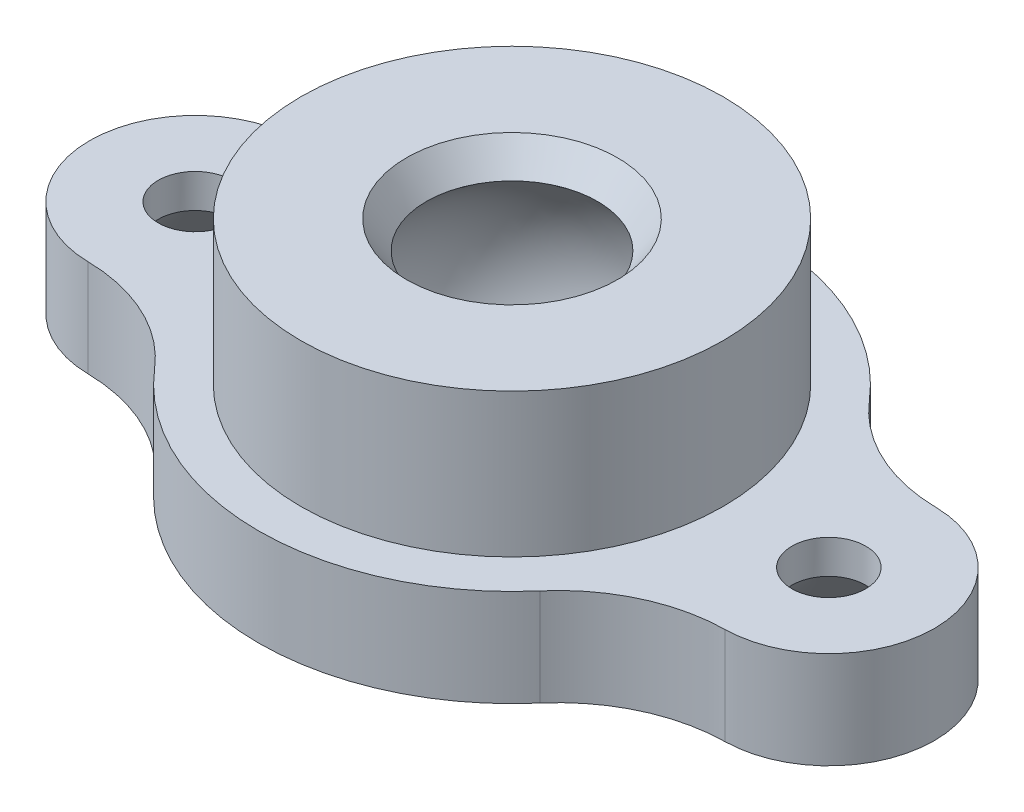
ISO-10303-21;
HEADER;
FILE_DESCRIPTION(('STEP AP214'),'2;1');
FILE_NAME('part.step','',(''),(''),'','','');
FILE_SCHEMA(('AUTOMOTIVE_DESIGN { 1 0 10303 214 1 1 1 1 }'));
ENDSEC;
DATA;
#1=APPLICATION_CONTEXT('core data for automotive mechanical design processes');
#2=APPLICATION_PROTOCOL_DEFINITION('international standard','automotive_design',2000,#1);
#3=PRODUCT_CONTEXT('',#1,'mechanical');
#4=PRODUCT('Part','Part','',(#3));
#5=PRODUCT_RELATED_PRODUCT_CATEGORY('part','',(#4));
#6=PRODUCT_DEFINITION_FORMATION('','',#4);
#7=PRODUCT_DEFINITION_CONTEXT('part definition',#1,'design');
#8=PRODUCT_DEFINITION('design','',#6,#7);
#9=PRODUCT_DEFINITION_SHAPE('','',#8);
#10=(LENGTH_UNIT() NAMED_UNIT(*) SI_UNIT(.MILLI.,.METRE.));
#11=(NAMED_UNIT(*) PLANE_ANGLE_UNIT() SI_UNIT($,.RADIAN.));
#12=(NAMED_UNIT(*) SI_UNIT($,.STERADIAN.) SOLID_ANGLE_UNIT());
#13=UNCERTAINTY_MEASURE_WITH_UNIT(LENGTH_MEASURE(1.E-05),#10,'distance_accuracy_value','');
#14=(GEOMETRIC_REPRESENTATION_CONTEXT(3) GLOBAL_UNCERTAINTY_ASSIGNED_CONTEXT((#13)) GLOBAL_UNIT_ASSIGNED_CONTEXT((#10,
#11,#12)) REPRESENTATION_CONTEXT('',''));
#15=CARTESIAN_POINT('',(0.,0.,0.));
#16=DIRECTION('',(0.,0.,1.));
#17=DIRECTION('',(1.,0.,0.));
#18=AXIS2_PLACEMENT_3D('',#15,#16,#17);
#19=CARTESIAN_POINT('',(-20.,0.0999999999999979,0.));
#20=DIRECTION('',(0.,1.,0.));
#21=DIRECTION('',(0.,0.,1.));
#22=AXIS2_PLACEMENT_3D('',#19,#20,#21);
#23=PLANE('',#22);
#24=CARTESIAN_POINT('',(-15.,0.0999999999999979,0.));
#25=DIRECTION('',(0.,1.,0.));
#26=DIRECTION('',(0.,0.,1.));
#27=AXIS2_PLACEMENT_3D('',#24,#25,#26);
#28=CIRCLE('',#27,1.75);
#29=CARTESIAN_POINT('',(-15.,0.0999999999999979,1.75));
#30=VERTEX_POINT('',#29);
#31=EDGE_CURVE('E170',#30,#30,#28,.T.);
#32=ORIENTED_EDGE('',*,*,#31,.F.);
#33=EDGE_LOOP('',(#32));
#34=FACE_BOUND('',#33,.T.);
#35=CARTESIAN_POINT('',(15.,0.0999999999999979,0.));
#36=DIRECTION('',(0.,1.,0.));
#37=DIRECTION('',(0.,0.,1.));
#38=AXIS2_PLACEMENT_3D('',#35,#36,#37);
#39=CIRCLE('',#38,1.75);
#40=CARTESIAN_POINT('',(15.,0.0999999999999979,1.74999999999999));
#41=VERTEX_POINT('',#40);
#42=EDGE_CURVE('E159',#41,#41,#39,.T.);
#43=ORIENTED_EDGE('',*,*,#42,.F.);
#44=EDGE_LOOP('',(#43));
#45=FACE_BOUND('',#44,.T.);
#46=CARTESIAN_POINT('',(0.,0.0999999999999994,0.));
#47=DIRECTION('',(0.,1.,0.));
#48=DIRECTION('',(0.,0.,1.));
#49=AXIS2_PLACEMENT_3D('',#46,#47,#48);
#50=CIRCLE('',#49,10.);
#51=CARTESIAN_POINT('',(0.,0.0999999999999994,10.));
#52=VERTEX_POINT('',#51);
#53=EDGE_CURVE('E181',#52,#52,#50,.T.);
#54=ORIENTED_EDGE('',*,*,#53,.F.);
#55=EDGE_LOOP('',(#54));
#56=FACE_BOUND('',#55,.T.);
#57=CARTESIAN_POINT('',(-15.2,0.0999999999999979,12.9984614474175));
#58=DIRECTION('',(0.,-1.,0.));
#59=DIRECTION('',(0.,0.,-1.));
#60=AXIS2_PLACEMENT_3D('',#57,#58,#59);
#61=CIRCLE('',#60,8.);
#62=CARTESIAN_POINT('',(-15.0769230769231,0.0999999999999979,4.99940824900674));
#63=VERTEX_POINT('',#62);
#64=CARTESIAN_POINT('',(-9.12,0.0999999999999979,7.79907686845052));
#65=VERTEX_POINT('',#64);
#66=EDGE_CURVE('E151',#63,#65,#61,.T.);
#67=ORIENTED_EDGE('',*,*,#66,.T.);
#68=CARTESIAN_POINT('',(0.,0.0999999999999979,0.));
#69=DIRECTION('',(0.,1.,0.));
#70=DIRECTION('',(0.,0.,1.));
#71=AXIS2_PLACEMENT_3D('',#68,#69,#70);
#72=CIRCLE('',#71,12.);
#73=CARTESIAN_POINT('',(9.12,0.0999999999999979,7.79907686845051));
#74=VERTEX_POINT('',#73);
#75=EDGE_CURVE('E154',#65,#74,#72,.T.);
#76=ORIENTED_EDGE('',*,*,#75,.T.);
#77=CARTESIAN_POINT('',(15.2,0.0999999999999979,12.9984614474175));
#78=DIRECTION('',(0.,-1.,0.));
#79=DIRECTION('',(0.,0.,1.));
#80=AXIS2_PLACEMENT_3D('',#77,#78,#79);
#81=CIRCLE('',#80,8.);
#82=CARTESIAN_POINT('',(15.0769230769231,0.0999999999999977,4.99940824900674));
#83=VERTEX_POINT('',#82);
#84=EDGE_CURVE('E140',#74,#83,#81,.T.);
#85=ORIENTED_EDGE('',*,*,#84,.T.);
#86=CARTESIAN_POINT('',(15.,0.0999999999999979,0.));
#87=DIRECTION('',(0.,1.,0.));
#88=DIRECTION('',(0.,0.,1.));
#89=AXIS2_PLACEMENT_3D('',#86,#87,#88);
#90=CIRCLE('',#89,5.);
#91=CARTESIAN_POINT('',(15.0769230769231,0.0999999999999977,-4.99940824900675));
#92=VERTEX_POINT('',#91);
#93=EDGE_CURVE('E57',#83,#92,#90,.T.);
#94=ORIENTED_EDGE('',*,*,#93,.T.);
#95=CARTESIAN_POINT('',(15.2,0.0999999999999979,-12.9984614474175));
#96=DIRECTION('',(0.,-1.,0.));
#97=DIRECTION('',(0.,0.,-1.));
#98=AXIS2_PLACEMENT_3D('',#95,#96,#97);
#99=CIRCLE('',#98,8.);
#100=CARTESIAN_POINT('',(9.11999999999999,0.0999999999999979,-7.79907686845052));
#101=VERTEX_POINT('',#100);
#102=EDGE_CURVE('E143',#92,#101,#99,.T.);
#103=ORIENTED_EDGE('',*,*,#102,.T.);
#104=CARTESIAN_POINT('',(0.,0.0999999999999979,0.));
#105=DIRECTION('',(0.,1.,0.));
#106=DIRECTION('',(0.,0.,1.));
#107=AXIS2_PLACEMENT_3D('',#104,#105,#106);
#108=CIRCLE('',#107,12.);
#109=CARTESIAN_POINT('',(-9.12,0.0999999999999979,-7.79907686845051));
#110=VERTEX_POINT('',#109);
#111=EDGE_CURVE('E115',#101,#110,#108,.T.);
#112=ORIENTED_EDGE('',*,*,#111,.T.);
#113=CARTESIAN_POINT('',(-15.2,0.0999999999999979,-12.9984614474175));
#114=DIRECTION('',(0.,-1.,0.));
#115=DIRECTION('',(0.,0.,1.));
#116=AXIS2_PLACEMENT_3D('',#113,#114,#115);
#117=CIRCLE('',#116,8.);
#118=CARTESIAN_POINT('',(-15.0769230769231,0.0999999999999979,-4.99940824900674));
#119=VERTEX_POINT('',#118);
#120=EDGE_CURVE('E146',#110,#119,#117,.T.);
#121=ORIENTED_EDGE('',*,*,#120,.T.);
#122=CARTESIAN_POINT('',(-15.,0.0999999999999979,0.));
#123=DIRECTION('',(0.,1.,0.));
#124=DIRECTION('',(0.,0.,1.));
#125=AXIS2_PLACEMENT_3D('',#122,#123,#124);
#126=CIRCLE('',#125,5.);
#127=EDGE_CURVE('E149',#119,#63,#126,.T.);
#128=ORIENTED_EDGE('',*,*,#127,.T.);
#129=EDGE_LOOP('',(#67,#76,#85,#94,#103,#112,#121,#128));
#130=FACE_BOUND('',#129,.T.);
#131=ADVANCED_FACE('F41',(#34,#45,#56,#130),#23,.T.);
#132=CARTESIAN_POINT('',(-7.42095060032743,-4.5,0.));
#133=DIRECTION('',(0.,-1.,0.));
#134=DIRECTION('',(0.,0.,-1.));
#135=AXIS2_PLACEMENT_3D('',#132,#133,#134);
#136=PLANE('',#135);
#137=CARTESIAN_POINT('',(15.,-4.5,0.));
#138=DIRECTION('',(0.,-1.,0.));
#139=DIRECTION('',(0.,0.,-1.));
#140=AXIS2_PLACEMENT_3D('',#137,#138,#139);
#141=CIRCLE('',#140,4.75);
#142=CARTESIAN_POINT('',(15.,-4.5,-4.75));
#143=VERTEX_POINT('',#142);
#144=EDGE_CURVE('E196',#143,#143,#141,.F.);
#145=ORIENTED_EDGE('',*,*,#144,.T.);
#146=EDGE_LOOP('',(#145));
#147=FACE_BOUND('',#146,.T.);
#148=CARTESIAN_POINT('',(-15.,-4.5,0.));
#149=DIRECTION('',(0.,-1.,0.));
#150=DIRECTION('',(0.,0.,-1.));
#151=AXIS2_PLACEMENT_3D('',#148,#149,#150);
#152=CIRCLE('',#151,4.75);
#153=CARTESIAN_POINT('',(-15.,-4.5,-4.75));
#154=VERTEX_POINT('',#153);
#155=EDGE_CURVE('E193',#154,#154,#152,.F.);
#156=ORIENTED_EDGE('',*,*,#155,.T.);
#157=EDGE_LOOP('',(#156));
#158=FACE_BOUND('',#157,.T.);
#159=CARTESIAN_POINT('',(0.,-4.5,0.));
#160=DIRECTION('',(0.,1.,0.));
#161=DIRECTION('',(0.,0.,1.));
#162=AXIS2_PLACEMENT_3D('',#159,#160,#161);
#163=CIRCLE('',#162,7.42095060032743);
#164=CARTESIAN_POINT('',(0.,-4.5,7.42095060032743));
#165=VERTEX_POINT('',#164);
#166=EDGE_CURVE('E178',#165,#165,#163,.T.);
#167=ORIENTED_EDGE('',*,*,#166,.T.);
#168=EDGE_LOOP('',(#167));
#169=FACE_BOUND('',#168,.T.);
#170=CARTESIAN_POINT('',(15.,-4.5,0.));
#171=DIRECTION('',(0.,-1.,0.));
#172=DIRECTION('',(0.,0.,-1.));
#173=AXIS2_PLACEMENT_3D('',#170,#171,#172);
#174=CIRCLE('',#173,5.);
#175=CARTESIAN_POINT('',(15.0769230769231,-4.5,-4.99940824900675));
#176=VERTEX_POINT('',#175);
#177=CARTESIAN_POINT('',(15.0769230769231,-4.5,4.99940824900674));
#178=VERTEX_POINT('',#177);
#179=EDGE_CURVE('E50',#176,#178,#174,.T.);
#180=ORIENTED_EDGE('',*,*,#179,.T.);
#181=CARTESIAN_POINT('',(15.2,-4.5,12.9984614474175));
#182=DIRECTION('',(0.,-1.,0.));
#183=DIRECTION('',(0.,0.,1.));
#184=AXIS2_PLACEMENT_3D('',#181,#182,#183);
#185=CIRCLE('',#184,8.);
#186=CARTESIAN_POINT('',(9.12,-4.5,7.79907686845051));
#187=VERTEX_POINT('',#186);
#188=EDGE_CURVE('E124',#187,#178,#185,.T.);
#189=ORIENTED_EDGE('',*,*,#188,.F.);
#190=CARTESIAN_POINT('',(0.,-4.5,0.));
#191=DIRECTION('',(0.,1.,0.));
#192=DIRECTION('',(0.,0.,1.));
#193=AXIS2_PLACEMENT_3D('',#190,#191,#192);
#194=CIRCLE('',#193,12.);
#195=CARTESIAN_POINT('',(-9.12,-4.5,7.79907686845052));
#196=VERTEX_POINT('',#195);
#197=EDGE_CURVE('E136',#196,#187,#194,.T.);
#198=ORIENTED_EDGE('',*,*,#197,.F.);
#199=CARTESIAN_POINT('',(-15.2,-4.5,12.9984614474175));
#200=DIRECTION('',(0.,-1.,0.));
#201=DIRECTION('',(0.,0.,-1.));
#202=AXIS2_PLACEMENT_3D('',#199,#200,#201);
#203=CIRCLE('',#202,8.);
#204=CARTESIAN_POINT('',(-15.0769230769231,-4.5,4.99940824900674));
#205=VERTEX_POINT('',#204);
#206=EDGE_CURVE('E130',#205,#196,#203,.T.);
#207=ORIENTED_EDGE('',*,*,#206,.F.);
#208=CARTESIAN_POINT('',(-15.,-4.5,0.));
#209=DIRECTION('',(0.,-1.,0.));
#210=DIRECTION('',(0.,0.,-1.));
#211=AXIS2_PLACEMENT_3D('',#208,#209,#210);
#212=CIRCLE('',#211,5.);
#213=CARTESIAN_POINT('',(-15.0769230769231,-4.5,-4.99940824900674));
#214=VERTEX_POINT('',#213);
#215=EDGE_CURVE('E12',#205,#214,#212,.T.);
#216=ORIENTED_EDGE('',*,*,#215,.T.);
#217=CARTESIAN_POINT('',(-15.2,-4.5,-12.9984614474175));
#218=DIRECTION('',(0.,-1.,0.));
#219=DIRECTION('',(0.,0.,1.));
#220=AXIS2_PLACEMENT_3D('',#217,#218,#219);
#221=CIRCLE('',#220,8.);
#222=CARTESIAN_POINT('',(-9.12,-4.5,-7.79907686845051));
#223=VERTEX_POINT('',#222);
#224=EDGE_CURVE('E128',#223,#214,#221,.T.);
#225=ORIENTED_EDGE('',*,*,#224,.F.);
#226=CARTESIAN_POINT('',(0.,-4.5,0.));
#227=DIRECTION('',(0.,1.,0.));
#228=DIRECTION('',(0.,0.,1.));
#229=AXIS2_PLACEMENT_3D('',#226,#227,#228);
#230=CIRCLE('',#229,12.);
#231=CARTESIAN_POINT('',(9.11999999999999,-4.5,-7.79907686845052));
#232=VERTEX_POINT('',#231);
#233=EDGE_CURVE('E112',#232,#223,#230,.T.);
#234=ORIENTED_EDGE('',*,*,#233,.F.);
#235=CARTESIAN_POINT('',(15.2,-4.5,-12.9984614474175));
#236=DIRECTION('',(0.,-1.,0.));
#237=DIRECTION('',(0.,0.,-1.));
#238=AXIS2_PLACEMENT_3D('',#235,#236,#237);
#239=CIRCLE('',#238,8.);
#240=EDGE_CURVE('E121',#176,#232,#239,.T.);
#241=ORIENTED_EDGE('',*,*,#240,.F.);
#242=EDGE_LOOP('',(#180,#189,#198,#207,#216,#225,#234,#241));
#243=FACE_BOUND('',#242,.T.);
#244=ADVANCED_FACE('F126',(#147,#158,#169,#243),#136,.T.);
#245=CARTESIAN_POINT('',(0.,0.,0.));
#246=DIRECTION('',(0.,1.,0.));
#247=DIRECTION('',(-1.,0.,0.));
#248=AXIS2_PLACEMENT_3D('',#245,#246,#247);
#249=SPHERICAL_SURFACE('',#248,6.9);
#250=CARTESIAN_POINT('',(0.,5.58727391516269,0.));
#251=DIRECTION('',(0.,1.,0.));
#252=DIRECTION('',(0.,0.,1.));
#253=AXIS2_PLACEMENT_3D('',#250,#251,#252);
#254=CIRCLE('',#253,4.04874921388601);
#255=CARTESIAN_POINT('',(-4.04874921388601,5.58727391516269,0.));
#256=VERTEX_POINT('',#255);
#257=EDGE_CURVE('E190',#256,#256,#254,.T.);
#258=CARTESIAN_POINT('',(0.,-3.57770876399966,0.));
#259=DIRECTION('',(0.,1.,0.));
#260=DIRECTION('',(0.,0.,1.));
#261=AXIS2_PLACEMENT_3D('',#258,#259,#260);
#262=CIRCLE('',#261,5.9);
#263=CARTESIAN_POINT('',(-5.9,-3.57770876399966,0.));
#264=VERTEX_POINT('',#263);
#265=EDGE_CURVE('E173',#264,#264,#262,.T.);
#266=CARTESIAN_POINT('',(-4.04874921388601,5.58727391516269,0.));
#267=CARTESIAN_POINT('',(-4.13540155335917,5.52448475205164,0.));
#268=CARTESIAN_POINT('',(-4.22059083952273,5.45967684104386,0.));
#269=CARTESIAN_POINT('',(-4.38786423232449,5.3261704263704,0.));
#270=CARTESIAN_POINT('',(-4.46994833896269,5.25747192270472,0.));
#271=CARTESIAN_POINT('',(-4.63083229980757,5.11633122585099,0.));
#272=CARTESIAN_POINT('',(-4.70963215401425,5.04388903266294,0.));
#273=CARTESIAN_POINT('',(-4.86377744586409,4.89541821849683,0.));
#274=CARTESIAN_POINT('',(-4.93912288350725,4.81938959751876,0.));
#275=CARTESIAN_POINT('',(-5.08619617190286,4.66391034697476,0.));
#276=CARTESIAN_POINT('',(-5.1579240226553,4.58445971740883,0.));
#277=CARTESIAN_POINT('',(-5.29760692568822,4.42230843705317,0.));
#278=CARTESIAN_POINT('',(-5.3655619779687,4.33960778626345,0.));
#279=CARTESIAN_POINT('',(-5.49755220321306,4.17113544136407,0.));
#280=CARTESIAN_POINT('',(-5.56158737617694,4.08536374725442,0.));
#281=CARTESIAN_POINT('',(-5.68559925492867,3.91093495183625,0.));
#282=CARTESIAN_POINT('',(-5.74557596071652,3.82227785052774,0.));
#283=CARTESIAN_POINT('',(-5.86134109841471,3.64227011853566,0.));
#284=CARTESIAN_POINT('',(-5.91712953032505,3.55091948785209,0.));
#285=CARTESIAN_POINT('',(-6.02439737881602,3.36572240531107,0.));
#286=CARTESIAN_POINT('',(-6.07587679539664,3.27187595345362,0.));
#287=CARTESIAN_POINT('',(-6.17441519749807,3.08189033818944,0.));
#288=CARTESIAN_POINT('',(-6.22147418301887,2.98575117478271,0.));
#289=CARTESIAN_POINT('',(-6.31106987435352,2.79138820816627,0.));
#290=CARTESIAN_POINT('',(-6.35360658016737,2.69316440495656,0.));
#291=CARTESIAN_POINT('',(-6.43406565089194,2.49484474220139,0.));
#292=CARTESIAN_POINT('',(-6.47198801580267,2.39474888265593,0.));
#293=CARTESIAN_POINT('',(-6.54313633023791,2.19290174234833,0.));
#294=CARTESIAN_POINT('',(-6.57636227976242,2.0911504615862,0.));
#295=CARTESIAN_POINT('',(-6.63804585328275,1.88621269675246,0.));
#296=CARTESIAN_POINT('',(-6.66650347727858,1.78302621268085,0.));
#297=CARTESIAN_POINT('',(-6.71858880957427,1.57544136531248,0.));
#298=CARTESIAN_POINT('',(-6.74221651787414,1.47104300201573,0.));
#299=CARTESIAN_POINT('',(-6.7845908818837,1.26126034312305,0.));
#300=CARTESIAN_POINT('',(-6.80333753759339,1.15587604752713,0.));
#301=CARTESIAN_POINT('',(-6.83590922347592,0.944349604792255,0.));
#302=CARTESIAN_POINT('',(-6.84973425364875,0.838207457653298,0.));
#303=CARTESIAN_POINT('',(-6.87243276726933,0.625395032788807,0.));
#304=CARTESIAN_POINT('',(-6.88130625071709,0.518724755063275,0.));
#305=CARTESIAN_POINT('',(-6.89408246621596,0.305086933002535,0.));
#306=CARTESIAN_POINT('',(-6.89798519826707,0.198119388667329,0.));
#307=CARTESIAN_POINT('',(-6.9008114643803,-0.015881459268009,0.));
#308=CARTESIAN_POINT('',(-6.89973499844242,-0.12291476286814,0.));
#309=CARTESIAN_POINT('',(-6.89260519835144,-0.336815479669978,0.));
#310=CARTESIAN_POINT('',(-6.88655186419833,-0.443682892871684,0.));
#311=CARTESIAN_POINT('',(-6.86948142875161,-0.65702053823619,0.));
#312=CARTESIAN_POINT('',(-6.85846432745799,-0.763490770398989,0.));
#313=CARTESIAN_POINT('',(-6.83149020183698,-0.97580362269147,0.));
#314=CARTESIAN_POINT('',(-6.81553317750959,-1.08164624282115,0.));
#315=CARTESIAN_POINT('',(-6.77871374103576,-1.29247479824229,0.));
#316=CARTESIAN_POINT('',(-6.75785132888933,-1.39746073353374,0.));
#317=CARTESIAN_POINT('',(-6.71126626954611,-1.60634870108705,0.));
#318=CARTESIAN_POINT('',(-6.68554362234932,-1.71025073334891,0.));
#319=CARTESIAN_POINT('',(-6.62929376106489,-1.91674602061095,0.));
#320=CARTESIAN_POINT('',(-6.59876654697723,-2.01933927561113,0.));
#321=CARTESIAN_POINT('',(-6.53297363155073,-2.22299497378913,0.));
#322=CARTESIAN_POINT('',(-6.49770793021189,-2.32405741696694,0.));
#323=CARTESIAN_POINT('',(-6.42251432654549,-2.52443274348416,0.));
#324=CARTESIAN_POINT('',(-6.38258642421794,-2.62374562682356,0.));
#325=CARTESIAN_POINT('',(-6.29815497715538,-2.82040697128541,0.));
#326=CARTESIAN_POINT('',(-6.25365143242037,-2.91775543240786,0.));
#327=CARTESIAN_POINT('',(-6.16016448274675,-3.11027695174067,0.));
#328=CARTESIAN_POINT('',(-6.11118107780813,-3.20545000995104,0.));
#329=CARTESIAN_POINT('',(-6.00884242089203,-3.39341583130956,0.));
#330=CARTESIAN_POINT('',(-5.95548716891454,-3.4862085944577,0.));
#331=CARTESIAN_POINT('',(-5.9,-3.57770876399966,0.));
#332=B_SPLINE_CURVE_WITH_KNOTS('',3,(#266,#267,#268,#269,#270,#271,#272,#273,#274,#275,#276,
#277,#278,#279,#280,#281,#282,#283,#284,#285,#286,#287,#288,#289,#290,#291,#292,#293,#294,#295,
#296,#297,#298,#299,#300,#301,#302,#303,#304,#305,#306,#307,#308,#309,#310,#311,#312,#313,#314,
#315,#316,#317,#318,#319,#320,#321,#322,#323,#324,#325,#326,#327,#328,#329,#330,#331),
.UNSPECIFIED.,.F.,.F.,(4,2,2,2,2,2,2,2,2,2,2,2,2,2,2,2,2,2,2,2,2,2,2,2,2,2,2,2,2,2,2,2,4),(0.,
0.321000319210128,0.642000638420253,0.96300095763038,1.28400127684051,1.60500159605063,
1.92600191526076,2.24700223447089,2.56800255368101,2.88900287289114,3.21000319210127,
3.53100351131139,3.85200383052152,4.17300414973165,4.49400446894177,4.8150047881519,
5.13600510736203,5.45700542657215,5.77800574578228,6.09900606499241,6.42000638420253,
6.74100670341266,7.06200702262279,7.38300734183291,7.70400766104304,8.02500798025317,
8.34600829946329,8.66700861867342,8.98800893788355,9.30900925709367,9.6300095763038,
9.95100989551393,10.2720102147241),.UNSPECIFIED.);
#333=EDGE_CURVE('BSEAM217',#256,#264,#332,.T.);
#334=ORIENTED_EDGE('',*,*,#257,.T.);
#335=ORIENTED_EDGE('',*,*,#265,.F.);
#336=ORIENTED_EDGE('',*,*,#333,.T.);
#337=ORIENTED_EDGE('',*,*,#333,.F.);
#338=EDGE_LOOP('',(#334,#336,#335,#337));
#339=FACE_BOUND('',#338,.T.);
#340=ADVANCED_FACE('F217',(#339),#249,.F.);
#341=CARTESIAN_POINT('',(0.,5.58727391516269,0.));
#342=DIRECTION('',(0.,1.,0.));
#343=DIRECTION('',(0.,0.,1.));
#344=AXIS2_PLACEMENT_3D('',#341,#342,#343);
#345=CONICAL_SURFACE('',#344,4.04874921388601,0.627070662589018);
#346=CARTESIAN_POINT('',(0.,6.9,0.));
#347=DIRECTION('',(0.,1.,0.));
#348=DIRECTION('',(0.,0.,1.));
#349=AXIS2_PLACEMENT_3D('',#346,#347,#348);
#350=CIRCLE('',#349,5.);
#351=CARTESIAN_POINT('',(0.,6.9,5.));
#352=VERTEX_POINT('',#351);
#353=EDGE_CURVE('E187',#352,#352,#350,.T.);
#354=ORIENTED_EDGE('',*,*,#353,.T.);
#355=EDGE_LOOP('',(#354));
#356=FACE_BOUND('',#355,.T.);
#357=ORIENTED_EDGE('',*,*,#257,.F.);
#358=EDGE_LOOP('',(#357));
#359=FACE_BOUND('',#358,.T.);
#360=ADVANCED_FACE('F247',(#356,#359),#345,.F.);
#361=CARTESIAN_POINT('',(-10.,6.9,0.));
#362=DIRECTION('',(0.,1.,0.));
#363=DIRECTION('',(0.,0.,1.));
#364=AXIS2_PLACEMENT_3D('',#361,#362,#363);
#365=PLANE('',#364);
#366=CARTESIAN_POINT('',(0.,6.9,0.));
#367=DIRECTION('',(0.,1.,0.));
#368=DIRECTION('',(0.,0.,1.));
#369=AXIS2_PLACEMENT_3D('',#366,#367,#368);
#370=CIRCLE('',#369,10.);
#371=CARTESIAN_POINT('',(0.,6.9,10.));
#372=VERTEX_POINT('',#371);
#373=EDGE_CURVE('E184',#372,#372,#370,.T.);
#374=ORIENTED_EDGE('',*,*,#373,.T.);
#375=EDGE_LOOP('',(#374));
#376=FACE_BOUND('',#375,.T.);
#377=ORIENTED_EDGE('',*,*,#353,.F.);
#378=EDGE_LOOP('',(#377));
#379=FACE_BOUND('',#378,.T.);
#380=ADVANCED_FACE('F234',(#376,#379),#365,.T.);
#381=CARTESIAN_POINT('',(0.,18.9741443999539,0.));
#382=DIRECTION('',(0.,1.,0.));
#383=DIRECTION('',(0.,0.,1.));
#384=AXIS2_PLACEMENT_3D('',#381,#382,#383);
#385=CYLINDRICAL_SURFACE('',#384,10.);
#386=ORIENTED_EDGE('',*,*,#53,.T.);
#387=EDGE_LOOP('',(#386));
#388=FACE_BOUND('',#387,.T.);
#389=ORIENTED_EDGE('',*,*,#373,.F.);
#390=EDGE_LOOP('',(#389));
#391=FACE_BOUND('',#390,.T.);
#392=ADVANCED_FACE('F225',(#388,#391),#385,.T.);
#393=CARTESIAN_POINT('',(0.,-4.5,0.));
#394=DIRECTION('',(0.,-1.,0.));
#395=DIRECTION('',(0.,0.,-1.));
#396=AXIS2_PLACEMENT_3D('',#393,#394,#395);
#397=CONICAL_SURFACE('',#396,7.42095060032743,1.02569057772453);
#398=ORIENTED_EDGE('',*,*,#265,.T.);
#399=EDGE_LOOP('',(#398));
#400=FACE_BOUND('',#399,.T.);
#401=ORIENTED_EDGE('',*,*,#166,.F.);
#402=EDGE_LOOP('',(#401));
#403=FACE_BOUND('',#402,.T.);
#404=ADVANCED_FACE('F222',(#400,#403),#397,.F.);
#405=CARTESIAN_POINT('',(15.,-4.5,0.));
#406=DIRECTION('',(0.,1.,0.));
#407=DIRECTION('',(0.,0.,1.));
#408=AXIS2_PLACEMENT_3D('',#405,#406,#407);
#409=CYLINDRICAL_SURFACE('',#408,1.75);
#410=CARTESIAN_POINT('',(15.,-1.49999999999999,0.));
#411=DIRECTION('',(0.,-1.,0.));
#412=DIRECTION('',(0.,0.,-1.));
#413=AXIS2_PLACEMENT_3D('',#410,#411,#412);
#414=CIRCLE('',#413,1.75);
#415=CARTESIAN_POINT('',(15.,-1.49999999999999,-1.75));
#416=VERTEX_POINT('',#415);
#417=EDGE_CURVE('E199',#416,#416,#414,.T.);
#418=ORIENTED_EDGE('',*,*,#417,.T.);
#419=EDGE_LOOP('',(#418));
#420=FACE_BOUND('',#419,.T.);
#421=ORIENTED_EDGE('',*,*,#42,.T.);
#422=EDGE_LOOP('',(#421));
#423=FACE_BOUND('',#422,.T.);
#424=ADVANCED_FACE('F224',(#420,#423),#409,.F.);
#425=CARTESIAN_POINT('',(-15.,-4.5,0.));
#426=DIRECTION('',(0.,1.,0.));
#427=DIRECTION('',(0.,0.,1.));
#428=AXIS2_PLACEMENT_3D('',#425,#426,#427);
#429=CYLINDRICAL_SURFACE('',#428,1.75);
#430=CARTESIAN_POINT('',(-15.,-1.49999999999999,0.));
#431=DIRECTION('',(0.,-1.,0.));
#432=DIRECTION('',(0.,0.,-1.));
#433=AXIS2_PLACEMENT_3D('',#430,#431,#432);
#434=CIRCLE('',#433,1.75);
#435=CARTESIAN_POINT('',(-15.,-1.49999999999999,-1.75));
#436=VERTEX_POINT('',#435);
#437=EDGE_CURVE('E202',#436,#436,#434,.T.);
#438=ORIENTED_EDGE('',*,*,#437,.T.);
#439=EDGE_LOOP('',(#438));
#440=FACE_BOUND('',#439,.T.);
#441=ORIENTED_EDGE('',*,*,#31,.T.);
#442=EDGE_LOOP('',(#441));
#443=FACE_BOUND('',#442,.T.);
#444=ADVANCED_FACE('F206',(#440,#443),#429,.F.);
#445=CARTESIAN_POINT('',(15.,-4.5,0.));
#446=DIRECTION('',(0.,-1.,0.));
#447=DIRECTION('',(0.,0.,-1.));
#448=AXIS2_PLACEMENT_3D('',#445,#446,#447);
#449=CONICAL_SURFACE('',#448,4.75,0.785398163397446);
#450=CARTESIAN_POINT('',(15.,-1.49999999999999,-1.75));
#451=CARTESIAN_POINT('',(15.,-1.53124999999999,-1.78125));
#452=CARTESIAN_POINT('',(15.,-1.56249999999999,-1.8125));
#453=CARTESIAN_POINT('',(15.,-1.62499999999999,-1.875));
#454=CARTESIAN_POINT('',(15.,-1.65624999999999,-1.90625));
#455=CARTESIAN_POINT('',(15.,-1.71874999999999,-1.96875));
#456=CARTESIAN_POINT('',(15.,-1.74999999999999,-2.));
#457=CARTESIAN_POINT('',(15.,-1.81249999999999,-2.0625));
#458=CARTESIAN_POINT('',(15.,-1.84374999999999,-2.09375));
#459=CARTESIAN_POINT('',(15.,-1.90624999999999,-2.15625));
#460=CARTESIAN_POINT('',(15.,-1.93749999999999,-2.1875));
#461=CARTESIAN_POINT('',(15.,-1.99999999999999,-2.25));
#462=CARTESIAN_POINT('',(15.,-2.03124999999999,-2.28125));
#463=CARTESIAN_POINT('',(15.,-2.09374999999999,-2.34375));
#464=CARTESIAN_POINT('',(15.,-2.12499999999999,-2.375));
#465=CARTESIAN_POINT('',(15.,-2.18749999999999,-2.4375));
#466=CARTESIAN_POINT('',(15.,-2.21874999999999,-2.46875));
#467=CARTESIAN_POINT('',(15.,-2.28124999999999,-2.53125));
#468=CARTESIAN_POINT('',(15.,-2.31249999999999,-2.5625));
#469=CARTESIAN_POINT('',(15.,-2.37499999999999,-2.625));
#470=CARTESIAN_POINT('',(15.,-2.40624999999999,-2.65625));
#471=CARTESIAN_POINT('',(15.,-2.46874999999999,-2.71875));
#472=CARTESIAN_POINT('',(15.,-2.49999999999999,-2.75));
#473=CARTESIAN_POINT('',(15.,-2.56249999999999,-2.8125));
#474=CARTESIAN_POINT('',(15.,-2.59374999999999,-2.84375));
#475=CARTESIAN_POINT('',(15.,-2.65624999999999,-2.90625));
#476=CARTESIAN_POINT('',(15.,-2.68749999999999,-2.9375));
#477=CARTESIAN_POINT('',(15.,-2.74999999999999,-3.));
#478=CARTESIAN_POINT('',(15.,-2.78124999999999,-3.03125));
#479=CARTESIAN_POINT('',(15.,-2.84374999999999,-3.09375));
#480=CARTESIAN_POINT('',(15.,-2.87499999999999,-3.125));
#481=CARTESIAN_POINT('',(15.,-2.93749999999999,-3.1875));
#482=CARTESIAN_POINT('',(15.,-2.96874999999999,-3.21875));
#483=CARTESIAN_POINT('',(15.,-3.03124999999999,-3.28125));
#484=CARTESIAN_POINT('',(15.,-3.0625,-3.3125));
#485=CARTESIAN_POINT('',(15.,-3.125,-3.375));
#486=CARTESIAN_POINT('',(15.,-3.15625,-3.40625));
#487=CARTESIAN_POINT('',(15.,-3.21875,-3.46875));
#488=CARTESIAN_POINT('',(15.,-3.25,-3.5));
#489=CARTESIAN_POINT('',(15.,-3.3125,-3.5625));
#490=CARTESIAN_POINT('',(15.,-3.34375,-3.59375));
#491=CARTESIAN_POINT('',(15.,-3.40625,-3.65625));
#492=CARTESIAN_POINT('',(15.,-3.4375,-3.6875));
#493=CARTESIAN_POINT('',(15.,-3.5,-3.75));
#494=CARTESIAN_POINT('',(15.,-3.53125,-3.78125));
#495=CARTESIAN_POINT('',(15.,-3.59375,-3.84375));
#496=CARTESIAN_POINT('',(15.,-3.625,-3.875));
#497=CARTESIAN_POINT('',(15.,-3.6875,-3.9375));
#498=CARTESIAN_POINT('',(15.,-3.71875,-3.96875));
#499=CARTESIAN_POINT('',(15.,-3.78125,-4.03125));
#500=CARTESIAN_POINT('',(15.,-3.8125,-4.0625));
#501=CARTESIAN_POINT('',(15.,-3.875,-4.125));
#502=CARTESIAN_POINT('',(15.,-3.90625,-4.15625));
#503=CARTESIAN_POINT('',(15.,-3.96875,-4.21875));
#504=CARTESIAN_POINT('',(15.,-4.,-4.25));
#505=CARTESIAN_POINT('',(15.,-4.0625,-4.3125));
#506=CARTESIAN_POINT('',(15.,-4.09375,-4.34375));
#507=CARTESIAN_POINT('',(15.,-4.15625,-4.40625));
#508=CARTESIAN_POINT('',(15.,-4.1875,-4.4375));
#509=CARTESIAN_POINT('',(15.,-4.25,-4.5));
#510=CARTESIAN_POINT('',(15.,-4.28125,-4.53125));
#511=CARTESIAN_POINT('',(15.,-4.34375,-4.59375));
#512=CARTESIAN_POINT('',(15.,-4.375,-4.625));
#513=CARTESIAN_POINT('',(15.,-4.4375,-4.6875));
#514=CARTESIAN_POINT('',(15.,-4.46875,-4.71875));
#515=CARTESIAN_POINT('',(15.,-4.5,-4.75));
#516=B_SPLINE_CURVE_WITH_KNOTS('',3,(#450,#451,#452,#453,#454,#455,#456,#457,#458,#459,#460,
#461,#462,#463,#464,#465,#466,#467,#468,#469,#470,#471,#472,#473,#474,#475,#476,#477,#478,#479,
#480,#481,#482,#483,#484,#485,#486,#487,#488,#489,#490,#491,#492,#493,#494,#495,#496,#497,#498,
#499,#500,#501,#502,#503,#504,#505,#506,#507,#508,#509,#510,#511,#512,#513,#514,#515),
.UNSPECIFIED.,.F.,.F.,(4,2,2,2,2,2,2,2,2,2,2,2,2,2,2,2,2,2,2,2,2,2,2,2,2,2,2,2,2,2,2,2,4),(0.,
0.132582521472478,0.265165042944956,0.397747564417434,0.530330085889912,0.66291260736239,
0.795495128834867,0.928077650307345,1.06066017177982,1.1932426932523,1.32582521472478,
1.45840773619726,1.59099025766973,1.72357277914221,1.85615530061469,1.98873782208717,
2.12132034355965,2.25390286503212,2.3864853865046,2.51906790797708,2.65165042944956,
2.78423295092204,2.91681547239451,3.04939799386699,3.18198051533947,3.31456303681195,
3.44714555828443,3.5797280797569,3.71231060122938,3.84489312270186,3.97747564417434,
4.11005816564681,4.24264068711929),.UNSPECIFIED.);
#517=EDGE_CURVE('BSEAM212',#416,#143,#516,.T.);
#518=ORIENTED_EDGE('',*,*,#417,.F.);
#519=ORIENTED_EDGE('',*,*,#144,.F.);
#520=ORIENTED_EDGE('',*,*,#517,.T.);
#521=ORIENTED_EDGE('',*,*,#517,.F.);
#522=EDGE_LOOP('',(#518,#520,#519,#521));
#523=FACE_BOUND('',#522,.T.);
#524=ADVANCED_FACE('F212',(#523),#449,.F.);
#525=CARTESIAN_POINT('',(-15.,-4.5,0.));
#526=DIRECTION('',(0.,-1.,0.));
#527=DIRECTION('',(0.,0.,-1.));
#528=AXIS2_PLACEMENT_3D('',#525,#526,#527);
#529=CONICAL_SURFACE('',#528,4.75,0.785398163397446);
#530=CARTESIAN_POINT('',(-15.,-1.49999999999999,-1.75));
#531=CARTESIAN_POINT('',(-15.,-1.53124999999999,-1.78125));
#532=CARTESIAN_POINT('',(-15.,-1.56249999999999,-1.8125));
#533=CARTESIAN_POINT('',(-15.,-1.62499999999999,-1.875));
#534=CARTESIAN_POINT('',(-15.,-1.65624999999999,-1.90625));
#535=CARTESIAN_POINT('',(-15.,-1.71874999999999,-1.96875));
#536=CARTESIAN_POINT('',(-15.,-1.74999999999999,-2.));
#537=CARTESIAN_POINT('',(-15.,-1.81249999999999,-2.0625));
#538=CARTESIAN_POINT('',(-15.,-1.84374999999999,-2.09375));
#539=CARTESIAN_POINT('',(-15.,-1.90624999999999,-2.15625));
#540=CARTESIAN_POINT('',(-15.,-1.93749999999999,-2.1875));
#541=CARTESIAN_POINT('',(-15.,-1.99999999999999,-2.25));
#542=CARTESIAN_POINT('',(-15.,-2.03124999999999,-2.28125));
#543=CARTESIAN_POINT('',(-15.,-2.09374999999999,-2.34375));
#544=CARTESIAN_POINT('',(-15.,-2.12499999999999,-2.375));
#545=CARTESIAN_POINT('',(-15.,-2.18749999999999,-2.4375));
#546=CARTESIAN_POINT('',(-15.,-2.21874999999999,-2.46875));
#547=CARTESIAN_POINT('',(-15.,-2.28124999999999,-2.53125));
#548=CARTESIAN_POINT('',(-15.,-2.31249999999999,-2.5625));
#549=CARTESIAN_POINT('',(-15.,-2.37499999999999,-2.625));
#550=CARTESIAN_POINT('',(-15.,-2.40624999999999,-2.65625));
#551=CARTESIAN_POINT('',(-15.,-2.46874999999999,-2.71875));
#552=CARTESIAN_POINT('',(-15.,-2.49999999999999,-2.75));
#553=CARTESIAN_POINT('',(-15.,-2.56249999999999,-2.8125));
#554=CARTESIAN_POINT('',(-15.,-2.59374999999999,-2.84375));
#555=CARTESIAN_POINT('',(-15.,-2.65624999999999,-2.90625));
#556=CARTESIAN_POINT('',(-15.,-2.68749999999999,-2.9375));
#557=CARTESIAN_POINT('',(-15.,-2.74999999999999,-3.));
#558=CARTESIAN_POINT('',(-15.,-2.78124999999999,-3.03125));
#559=CARTESIAN_POINT('',(-15.,-2.84374999999999,-3.09375));
#560=CARTESIAN_POINT('',(-15.,-2.87499999999999,-3.125));
#561=CARTESIAN_POINT('',(-15.,-2.93749999999999,-3.1875));
#562=CARTESIAN_POINT('',(-15.,-2.96874999999999,-3.21875));
#563=CARTESIAN_POINT('',(-15.,-3.03124999999999,-3.28125));
#564=CARTESIAN_POINT('',(-15.,-3.0625,-3.3125));
#565=CARTESIAN_POINT('',(-15.,-3.125,-3.375));
#566=CARTESIAN_POINT('',(-15.,-3.15625,-3.40625));
#567=CARTESIAN_POINT('',(-15.,-3.21875,-3.46875));
#568=CARTESIAN_POINT('',(-15.,-3.25,-3.5));
#569=CARTESIAN_POINT('',(-15.,-3.3125,-3.5625));
#570=CARTESIAN_POINT('',(-15.,-3.34375,-3.59375));
#571=CARTESIAN_POINT('',(-15.,-3.40625,-3.65625));
#572=CARTESIAN_POINT('',(-15.,-3.4375,-3.6875));
#573=CARTESIAN_POINT('',(-15.,-3.5,-3.75));
#574=CARTESIAN_POINT('',(-15.,-3.53125,-3.78125));
#575=CARTESIAN_POINT('',(-15.,-3.59375,-3.84375));
#576=CARTESIAN_POINT('',(-15.,-3.625,-3.875));
#577=CARTESIAN_POINT('',(-15.,-3.6875,-3.9375));
#578=CARTESIAN_POINT('',(-15.,-3.71875,-3.96875));
#579=CARTESIAN_POINT('',(-15.,-3.78125,-4.03125));
#580=CARTESIAN_POINT('',(-15.,-3.8125,-4.0625));
#581=CARTESIAN_POINT('',(-15.,-3.875,-4.125));
#582=CARTESIAN_POINT('',(-15.,-3.90625,-4.15625));
#583=CARTESIAN_POINT('',(-15.,-3.96875,-4.21875));
#584=CARTESIAN_POINT('',(-15.,-4.,-4.25));
#585=CARTESIAN_POINT('',(-15.,-4.0625,-4.3125));
#586=CARTESIAN_POINT('',(-15.,-4.09375,-4.34375));
#587=CARTESIAN_POINT('',(-15.,-4.15625,-4.40625));
#588=CARTESIAN_POINT('',(-15.,-4.1875,-4.4375));
#589=CARTESIAN_POINT('',(-15.,-4.25,-4.5));
#590=CARTESIAN_POINT('',(-15.,-4.28125,-4.53125));
#591=CARTESIAN_POINT('',(-15.,-4.34375,-4.59375));
#592=CARTESIAN_POINT('',(-15.,-4.375,-4.625));
#593=CARTESIAN_POINT('',(-15.,-4.4375,-4.6875));
#594=CARTESIAN_POINT('',(-15.,-4.46875,-4.71875));
#595=CARTESIAN_POINT('',(-15.,-4.5,-4.75));
#596=B_SPLINE_CURVE_WITH_KNOTS('',3,(#530,#531,#532,#533,#534,#535,#536,#537,#538,#539,#540,
#541,#542,#543,#544,#545,#546,#547,#548,#549,#550,#551,#552,#553,#554,#555,#556,#557,#558,#559,
#560,#561,#562,#563,#564,#565,#566,#567,#568,#569,#570,#571,#572,#573,#574,#575,#576,#577,#578,
#579,#580,#581,#582,#583,#584,#585,#586,#587,#588,#589,#590,#591,#592,#593,#594,#595),
.UNSPECIFIED.,.F.,.F.,(4,2,2,2,2,2,2,2,2,2,2,2,2,2,2,2,2,2,2,2,2,2,2,2,2,2,2,2,2,2,2,2,4),(0.,
0.132582521472478,0.265165042944956,0.397747564417434,0.530330085889912,0.66291260736239,
0.795495128834867,0.928077650307345,1.06066017177982,1.1932426932523,1.32582521472478,
1.45840773619726,1.59099025766973,1.72357277914221,1.85615530061469,1.98873782208717,
2.12132034355965,2.25390286503212,2.3864853865046,2.51906790797708,2.65165042944956,
2.78423295092204,2.91681547239451,3.04939799386699,3.18198051533947,3.31456303681195,
3.44714555828443,3.5797280797569,3.71231060122938,3.84489312270186,3.97747564417434,
4.11005816564681,4.24264068711929),.UNSPECIFIED.);
#597=EDGE_CURVE('BSEAM44',#436,#154,#596,.T.);
#598=ORIENTED_EDGE('',*,*,#437,.F.);
#599=ORIENTED_EDGE('',*,*,#155,.F.);
#600=ORIENTED_EDGE('',*,*,#597,.T.);
#601=ORIENTED_EDGE('',*,*,#597,.F.);
#602=EDGE_LOOP('',(#598,#600,#599,#601));
#603=FACE_BOUND('',#602,.T.);
#604=ADVANCED_FACE('F44',(#603),#529,.F.);
#605=CARTESIAN_POINT('',(-15.,-4.5,0.));
#606=DIRECTION('',(0.,1.,0.));
#607=DIRECTION('',(0.,0.,1.));
#608=AXIS2_PLACEMENT_3D('',#605,#606,#607);
#609=CYLINDRICAL_SURFACE('',#608,5.);
#610=DIRECTION('',(0.,1.,0.));
#611=VECTOR('',#610,1.);
#612=CARTESIAN_POINT('',(-15.0769230769231,-4.5,-4.99940824900674));
#613=LINE('',#612,#611);
#614=EDGE_CURVE('E165',#214,#119,#613,.T.);
#615=ORIENTED_EDGE('',*,*,#614,.F.);
#616=ORIENTED_EDGE('',*,*,#215,.F.);
#617=DIRECTION('',(0.,1.,0.));
#618=VECTOR('',#617,1.);
#619=CARTESIAN_POINT('',(-15.0769230769231,-4.5,4.99940824900674));
#620=LINE('',#619,#618);
#621=EDGE_CURVE('E162',#205,#63,#620,.T.);
#622=ORIENTED_EDGE('',*,*,#621,.T.);
#623=ORIENTED_EDGE('',*,*,#127,.F.);
#624=EDGE_LOOP('',(#615,#616,#622,#623));
#625=FACE_BOUND('',#624,.T.);
#626=ADVANCED_FACE('F211',(#625),#609,.T.);
#627=CARTESIAN_POINT('',(15.,-4.5,0.));
#628=DIRECTION('',(0.,1.,0.));
#629=DIRECTION('',(0.,0.,1.));
#630=AXIS2_PLACEMENT_3D('',#627,#628,#629);
#631=CYLINDRICAL_SURFACE('',#630,5.);
#632=DIRECTION('',(0.,1.,0.));
#633=VECTOR('',#632,1.);
#634=CARTESIAN_POINT('',(15.0769230769231,-4.5,4.99940824900674));
#635=LINE('',#634,#633);
#636=EDGE_CURVE('E139',#178,#83,#635,.T.);
#637=ORIENTED_EDGE('',*,*,#636,.F.);
#638=ORIENTED_EDGE('',*,*,#179,.F.);
#639=DIRECTION('',(0.,1.,0.));
#640=VECTOR('',#639,1.);
#641=CARTESIAN_POINT('',(15.0769230769231,-4.5,-4.99940824900675));
#642=LINE('',#641,#640);
#643=EDGE_CURVE('E118',#176,#92,#642,.T.);
#644=ORIENTED_EDGE('',*,*,#643,.T.);
#645=ORIENTED_EDGE('',*,*,#93,.F.);
#646=EDGE_LOOP('',(#637,#638,#644,#645));
#647=FACE_BOUND('',#646,.T.);
#648=ADVANCED_FACE('F285',(#647),#631,.T.);
#649=CARTESIAN_POINT('',(15.2,-4.5,12.9984614474175));
#650=DIRECTION('',(0.,1.,0.));
#651=DIRECTION('',(0.,0.,1.));
#652=AXIS2_PLACEMENT_3D('',#649,#650,#651);
#653=CYLINDRICAL_SURFACE('',#652,8.);
#654=ORIENTED_EDGE('',*,*,#84,.F.);
#655=DIRECTION('',(0.,1.,0.));
#656=VECTOR('',#655,1.);
#657=CARTESIAN_POINT('',(9.12,-4.5,7.79907686845051));
#658=LINE('',#657,#656);
#659=EDGE_CURVE('E157',#187,#74,#658,.T.);
#660=ORIENTED_EDGE('',*,*,#659,.F.);
#661=ORIENTED_EDGE('',*,*,#188,.T.);
#662=ORIENTED_EDGE('',*,*,#636,.T.);
#663=EDGE_LOOP('',(#654,#660,#661,#662));
#664=FACE_BOUND('',#663,.T.);
#665=ADVANCED_FACE('F282',(#664),#653,.F.);
#666=CARTESIAN_POINT('',(0.,-4.5,0.));
#667=DIRECTION('',(0.,1.,0.));
#668=DIRECTION('',(0.,0.,1.));
#669=AXIS2_PLACEMENT_3D('',#666,#667,#668);
#670=CYLINDRICAL_SURFACE('',#669,12.);
#671=ORIENTED_EDGE('',*,*,#75,.F.);
#672=DIRECTION('',(0.,1.,0.));
#673=VECTOR('',#672,1.);
#674=CARTESIAN_POINT('',(-9.12,-4.5,7.79907686845052));
#675=LINE('',#674,#673);
#676=EDGE_CURVE('E160',#196,#65,#675,.T.);
#677=ORIENTED_EDGE('',*,*,#676,.F.);
#678=ORIENTED_EDGE('',*,*,#197,.T.);
#679=ORIENTED_EDGE('',*,*,#659,.T.);
#680=EDGE_LOOP('',(#671,#677,#678,#679));
#681=FACE_BOUND('',#680,.T.);
#682=ADVANCED_FACE('F279',(#681),#670,.T.);
#683=CARTESIAN_POINT('',(-15.2,-4.5,12.9984614474175));
#684=DIRECTION('',(0.,1.,0.));
#685=DIRECTION('',(0.,0.,1.));
#686=AXIS2_PLACEMENT_3D('',#683,#684,#685);
#687=CYLINDRICAL_SURFACE('',#686,8.);
#688=ORIENTED_EDGE('',*,*,#66,.F.);
#689=ORIENTED_EDGE('',*,*,#621,.F.);
#690=ORIENTED_EDGE('',*,*,#206,.T.);
#691=ORIENTED_EDGE('',*,*,#676,.T.);
#692=EDGE_LOOP('',(#688,#689,#690,#691));
#693=FACE_BOUND('',#692,.T.);
#694=ADVANCED_FACE('F275',(#693),#687,.F.);
#695=CARTESIAN_POINT('',(-15.2,-4.5,-12.9984614474175));
#696=DIRECTION('',(0.,1.,0.));
#697=DIRECTION('',(0.,0.,1.));
#698=AXIS2_PLACEMENT_3D('',#695,#696,#697);
#699=CYLINDRICAL_SURFACE('',#698,8.);
#700=ORIENTED_EDGE('',*,*,#120,.F.);
#701=DIRECTION('',(0.,1.,0.));
#702=VECTOR('',#701,1.);
#703=CARTESIAN_POINT('',(-9.12,-4.5,-7.79907686845051));
#704=LINE('',#703,#702);
#705=EDGE_CURVE('E117',#223,#110,#704,.T.);
#706=ORIENTED_EDGE('',*,*,#705,.F.);
#707=ORIENTED_EDGE('',*,*,#224,.T.);
#708=ORIENTED_EDGE('',*,*,#614,.T.);
#709=EDGE_LOOP('',(#700,#706,#707,#708));
#710=FACE_BOUND('',#709,.T.);
#711=ADVANCED_FACE('F300',(#710),#699,.F.);
#712=CARTESIAN_POINT('',(0.,-4.5,0.));
#713=DIRECTION('',(0.,1.,0.));
#714=DIRECTION('',(0.,0.,1.));
#715=AXIS2_PLACEMENT_3D('',#712,#713,#714);
#716=CYLINDRICAL_SURFACE('',#715,12.);
#717=ORIENTED_EDGE('',*,*,#111,.F.);
#718=DIRECTION('',(0.,1.,0.));
#719=VECTOR('',#718,1.);
#720=CARTESIAN_POINT('',(9.11999999999999,-4.5,-7.79907686845052));
#721=LINE('',#720,#719);
#722=EDGE_CURVE('E108',#232,#101,#721,.T.);
#723=ORIENTED_EDGE('',*,*,#722,.F.);
#724=ORIENTED_EDGE('',*,*,#233,.T.);
#725=ORIENTED_EDGE('',*,*,#705,.T.);
#726=EDGE_LOOP('',(#717,#723,#724,#725));
#727=FACE_BOUND('',#726,.T.);
#728=ADVANCED_FACE('F110',(#727),#716,.T.);
#729=CARTESIAN_POINT('',(15.2,-4.5,-12.9984614474175));
#730=DIRECTION('',(0.,1.,0.));
#731=DIRECTION('',(0.,0.,1.));
#732=AXIS2_PLACEMENT_3D('',#729,#730,#731);
#733=CYLINDRICAL_SURFACE('',#732,8.);
#734=ORIENTED_EDGE('',*,*,#102,.F.);
#735=ORIENTED_EDGE('',*,*,#643,.F.);
#736=ORIENTED_EDGE('',*,*,#240,.T.);
#737=ORIENTED_EDGE('',*,*,#722,.T.);
#738=EDGE_LOOP('',(#734,#735,#736,#737));
#739=FACE_BOUND('',#738,.T.);
#740=ADVANCED_FACE('F122',(#739),#733,.F.);
#741=CLOSED_SHELL('',(#131,#244,#340,#360,#380,#392,#404,#424,#444,#524,#604,#626,#648,#665,
#682,#694,#711,#728,#740));
#742=MANIFOLD_SOLID_BREP('B2',#741);
#743=ADVANCED_BREP_SHAPE_REPRESENTATION('',(#18,#742),#14);
#744=SHAPE_DEFINITION_REPRESENTATION(#9,#743);
ENDSEC;
END-ISO-10303-21;
